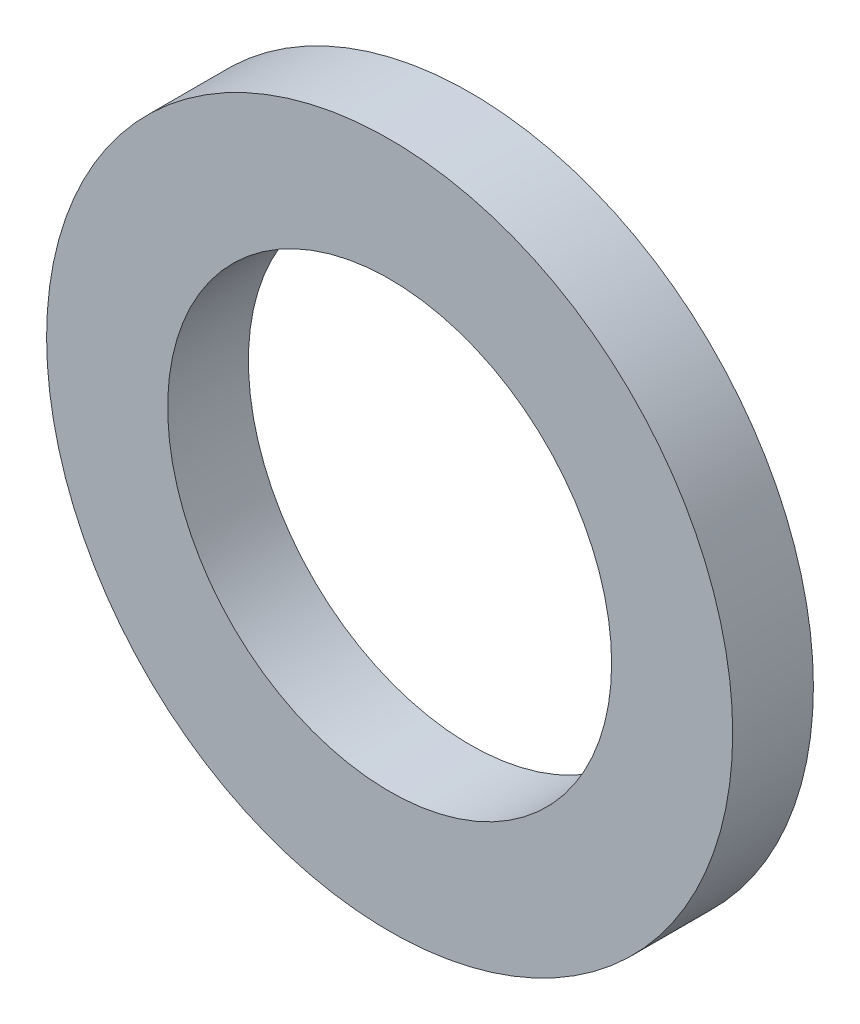
ISO-10303-21;
HEADER;
FILE_DESCRIPTION(('STEP AP214'),'2;1');
FILE_NAME('part.step','',(''),(''),'','','');
FILE_SCHEMA(('AUTOMOTIVE_DESIGN { 1 0 10303 214 1 1 1 1 }'));
ENDSEC;
DATA;
#1=APPLICATION_CONTEXT('core data for automotive mechanical design processes');
#2=APPLICATION_PROTOCOL_DEFINITION('international standard','automotive_design',2000,#1);
#3=PRODUCT_CONTEXT('',#1,'mechanical');
#4=PRODUCT('Part','Part','',(#3));
#5=PRODUCT_RELATED_PRODUCT_CATEGORY('part','',(#4));
#6=PRODUCT_DEFINITION_FORMATION('','',#4);
#7=PRODUCT_DEFINITION_CONTEXT('part definition',#1,'design');
#8=PRODUCT_DEFINITION('design','',#6,#7);
#9=PRODUCT_DEFINITION_SHAPE('','',#8);
#10=(LENGTH_UNIT() NAMED_UNIT(*) SI_UNIT(.MILLI.,.METRE.));
#11=(NAMED_UNIT(*) PLANE_ANGLE_UNIT() SI_UNIT($,.RADIAN.));
#12=(NAMED_UNIT(*) SI_UNIT($,.STERADIAN.) SOLID_ANGLE_UNIT());
#13=UNCERTAINTY_MEASURE_WITH_UNIT(LENGTH_MEASURE(1.E-05),#10,'distance_accuracy_value','');
#14=(GEOMETRIC_REPRESENTATION_CONTEXT(3) GLOBAL_UNCERTAINTY_ASSIGNED_CONTEXT((#13)) GLOBAL_UNIT_ASSIGNED_CONTEXT((#10,
#11,#12)) REPRESENTATION_CONTEXT('',''));
#15=CARTESIAN_POINT('',(0.,0.,0.));
#16=DIRECTION('',(0.,0.,1.));
#17=DIRECTION('',(1.,0.,0.));
#18=AXIS2_PLACEMENT_3D('',#15,#16,#17);
#19=CARTESIAN_POINT('',(0.,0.,0.));
#20=DIRECTION('',(0.,0.,1.));
#21=DIRECTION('',(1.,0.,0.));
#22=AXIS2_PLACEMENT_3D('',#19,#20,#21);
#23=PLANE('',#22);
#24=CARTESIAN_POINT('',(0.,0.,0.));
#25=DIRECTION('',(0.,0.,1.));
#26=DIRECTION('',(1.,0.,0.));
#27=AXIS2_PLACEMENT_3D('',#24,#25,#26);
#28=CIRCLE('',#27,27.5);
#29=CARTESIAN_POINT('',(27.5,0.,0.));
#30=VERTEX_POINT('',#29);
#31=EDGE_CURVE('E61',#30,#30,#28,.T.);
#32=ORIENTED_EDGE('',*,*,#31,.T.);
#33=EDGE_LOOP('',(#32));
#34=FACE_BOUND('',#33,.T.);
#35=CARTESIAN_POINT('',(0.,0.,0.));
#36=DIRECTION('',(0.,0.,1.));
#37=DIRECTION('',(1.,0.,0.));
#38=AXIS2_PLACEMENT_3D('',#35,#36,#37);
#39=CIRCLE('',#38,42.5);
#40=CARTESIAN_POINT('',(42.5,0.,0.));
#41=VERTEX_POINT('',#40);
#42=EDGE_CURVE('E54',#41,#41,#39,.T.);
#43=ORIENTED_EDGE('',*,*,#42,.F.);
#44=EDGE_LOOP('',(#43));
#45=FACE_BOUND('',#44,.T.);
#46=ADVANCED_FACE('F17',(#34,#45),#23,.F.);
#47=CARTESIAN_POINT('',(0.,0.,10.));
#48=DIRECTION('',(0.,0.,1.));
#49=DIRECTION('',(1.,0.,0.));
#50=AXIS2_PLACEMENT_3D('',#47,#48,#49);
#51=PLANE('',#50);
#52=CARTESIAN_POINT('',(0.,0.,10.));
#53=DIRECTION('',(0.,0.,1.));
#54=DIRECTION('',(1.,0.,0.));
#55=AXIS2_PLACEMENT_3D('',#52,#53,#54);
#56=CIRCLE('',#55,27.5);
#57=CARTESIAN_POINT('',(27.5,0.,10.));
#58=VERTEX_POINT('',#57);
#59=EDGE_CURVE('E47',#58,#58,#56,.T.);
#60=ORIENTED_EDGE('',*,*,#59,.F.);
#61=EDGE_LOOP('',(#60));
#62=FACE_BOUND('',#61,.T.);
#63=CARTESIAN_POINT('',(0.,0.,10.));
#64=DIRECTION('',(0.,0.,1.));
#65=DIRECTION('',(1.,0.,0.));
#66=AXIS2_PLACEMENT_3D('',#63,#64,#65);
#67=CIRCLE('',#66,42.5);
#68=CARTESIAN_POINT('',(42.5,0.,10.));
#69=VERTEX_POINT('',#68);
#70=EDGE_CURVE('E11',#69,#69,#67,.T.);
#71=ORIENTED_EDGE('',*,*,#70,.T.);
#72=EDGE_LOOP('',(#71));
#73=FACE_BOUND('',#72,.T.);
#74=ADVANCED_FACE('F72',(#62,#73),#51,.T.);
#75=CARTESIAN_POINT('',(0.,0.,5.));
#76=DIRECTION('',(0.,0.,-1.));
#77=DIRECTION('',(-1.,0.,0.));
#78=AXIS2_PLACEMENT_3D('',#75,#76,#77);
#79=CYLINDRICAL_SURFACE('',#78,42.5);
#80=ORIENTED_EDGE('',*,*,#42,.T.);
#81=DIRECTION('',(0.,0.,1.));
#82=VECTOR('',#81,1.);
#83=CARTESIAN_POINT('',(42.5,0.,5.));
#84=LINE('',#83,#82);
#85=EDGE_CURVE('E26',#41,#69,#84,.T.);
#86=ORIENTED_EDGE('',*,*,#85,.T.);
#87=ORIENTED_EDGE('',*,*,#70,.F.);
#88=ORIENTED_EDGE('',*,*,#85,.F.);
#89=EDGE_LOOP('',(#80,#86,#87,#88));
#90=FACE_BOUND('',#89,.T.);
#91=ADVANCED_FACE('F68',(#90),#79,.T.);
#92=CARTESIAN_POINT('',(0.,0.,5.));
#93=DIRECTION('',(0.,0.,-1.));
#94=DIRECTION('',(-1.,0.,0.));
#95=AXIS2_PLACEMENT_3D('',#92,#93,#94);
#96=CYLINDRICAL_SURFACE('',#95,27.5);
#97=ORIENTED_EDGE('',*,*,#31,.F.);
#98=DIRECTION('',(0.,0.,1.));
#99=VECTOR('',#98,1.);
#100=CARTESIAN_POINT('',(27.5,0.,5.));
#101=LINE('',#100,#99);
#102=EDGE_CURVE('E50',#30,#58,#101,.T.);
#103=ORIENTED_EDGE('',*,*,#102,.T.);
#104=ORIENTED_EDGE('',*,*,#59,.T.);
#105=ORIENTED_EDGE('',*,*,#102,.F.);
#106=EDGE_LOOP('',(#97,#103,#104,#105));
#107=FACE_BOUND('',#106,.T.);
#108=ADVANCED_FACE('F49',(#107),#96,.F.);
#109=CLOSED_SHELL('',(#46,#74,#91,#108));
#110=MANIFOLD_SOLID_BREP('B1',#109);
#111=ADVANCED_BREP_SHAPE_REPRESENTATION('',(#18,#110),#14);
#112=SHAPE_DEFINITION_REPRESENTATION(#9,#111);
ENDSEC;
END-ISO-10303-21;
